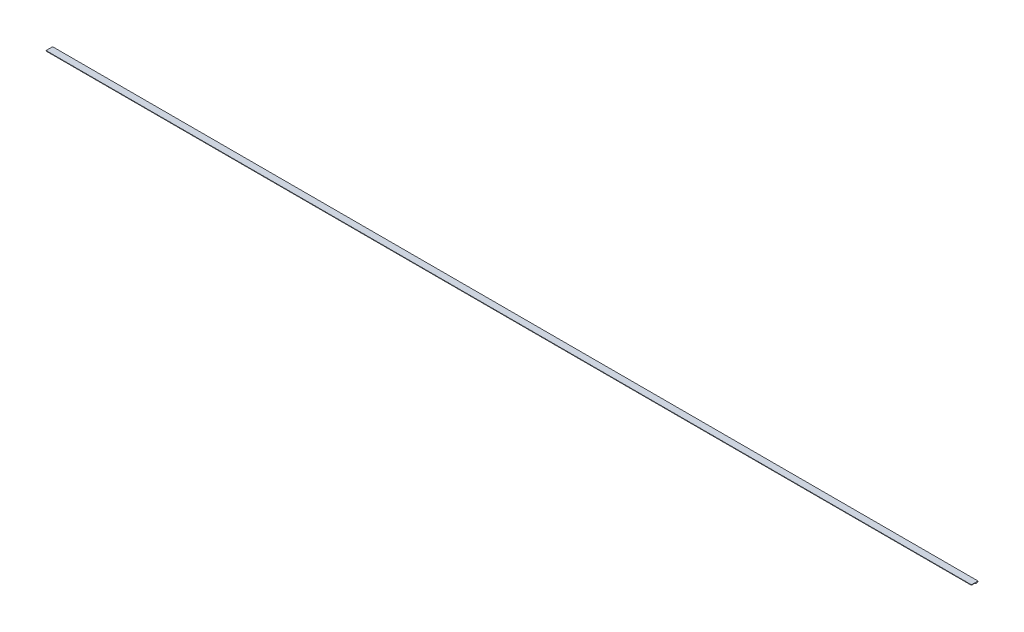
ISO-10303-21;
HEADER;
FILE_DESCRIPTION(('STEP AP214'),'2;1');
FILE_NAME('part.step','',(''),(''),'','','');
FILE_SCHEMA(('AUTOMOTIVE_DESIGN { 1 0 10303 214 1 1 1 1 }'));
ENDSEC;
DATA;
#1=APPLICATION_CONTEXT('core data for automotive mechanical design processes');
#2=APPLICATION_PROTOCOL_DEFINITION('international standard','automotive_design',2000,#1);
#3=PRODUCT_CONTEXT('',#1,'mechanical');
#4=PRODUCT('Part','Part','',(#3));
#5=PRODUCT_RELATED_PRODUCT_CATEGORY('part','',(#4));
#6=PRODUCT_DEFINITION_FORMATION('','',#4);
#7=PRODUCT_DEFINITION_CONTEXT('part definition',#1,'design');
#8=PRODUCT_DEFINITION('design','',#6,#7);
#9=PRODUCT_DEFINITION_SHAPE('','',#8);
#10=(LENGTH_UNIT() NAMED_UNIT(*) SI_UNIT(.MILLI.,.METRE.));
#11=(NAMED_UNIT(*) PLANE_ANGLE_UNIT() SI_UNIT($,.RADIAN.));
#12=(NAMED_UNIT(*) SI_UNIT($,.STERADIAN.) SOLID_ANGLE_UNIT());
#13=UNCERTAINTY_MEASURE_WITH_UNIT(LENGTH_MEASURE(1.E-05),#10,'distance_accuracy_value','');
#14=(GEOMETRIC_REPRESENTATION_CONTEXT(3) GLOBAL_UNCERTAINTY_ASSIGNED_CONTEXT((#13)) GLOBAL_UNIT_ASSIGNED_CONTEXT((#10,
#11,#12)) REPRESENTATION_CONTEXT('',''));
#15=CARTESIAN_POINT('',(0.,0.,0.));
#16=DIRECTION('',(0.,0.,1.));
#17=DIRECTION('',(1.,0.,0.));
#18=AXIS2_PLACEMENT_3D('',#15,#16,#17);
#19=CARTESIAN_POINT('',(1540.,-2.07695340816923,20.3369076558569));
#20=DIRECTION('',(1.,0.,0.));
#21=DIRECTION('',(0.,0.,-1.));
#22=AXIS2_PLACEMENT_3D('',#19,#20,#21);
#23=PLANE('',#22);
#24=DIRECTION('',(0.,-1.,0.));
#25=VECTOR('',#24,1.);
#26=CARTESIAN_POINT('',(1540.,0.,28.4739583333333));
#27=LINE('',#26,#25);
#28=CARTESIAN_POINT('',(1540.,0.,28.4739583333333));
#29=VERTEX_POINT('',#28);
#30=CARTESIAN_POINT('',(1540.,-0.759392904414108,28.4739583333333));
#31=VERTEX_POINT('',#30);
#32=EDGE_CURVE('E125',#29,#31,#27,.T.);
#33=ORIENTED_EDGE('',*,*,#32,.T.);
#34=DIRECTION('',(0.,0.,-1.));
#35=VECTOR('',#34,1.);
#36=CARTESIAN_POINT('',(1540.,-0.759392904414108,28.4739583333333));
#37=LINE('',#36,#35);
#38=CARTESIAN_POINT('',(1540.,-0.759392904414108,23.1998569783805));
#39=VERTEX_POINT('',#38);
#40=EDGE_CURVE('E84',#31,#39,#37,.T.);
#41=ORIENTED_EDGE('',*,*,#40,.T.);
#42=CARTESIAN_POINT('',(1540.,-0.759392904414108,23.1998569783805));
#43=CARTESIAN_POINT('',(1540.,-3.39451391192434,20.3369076558569));
#44=CARTESIAN_POINT('',(1540.,-0.759392904414107,17.4739583333333));
#45=B_SPLINE_CURVE_WITH_KNOTS('',2,(#42,#43,#44),.UNSPECIFIED.,.F.,.F.,(3,3),(0.,1.),.UNSPECIFIED.);
#46=CARTESIAN_POINT('',(1540.,-0.759392904414107,17.4739583333333));
#47=VERTEX_POINT('',#46);
#48=EDGE_CURVE('E88',#39,#47,#45,.T.);
#49=ORIENTED_EDGE('',*,*,#48,.T.);
#50=DIRECTION('',(0.,1.,0.));
#51=VECTOR('',#50,1.);
#52=CARTESIAN_POINT('',(1540.,-0.759392904414107,17.4739583333333));
#53=LINE('',#52,#51);
#54=CARTESIAN_POINT('',(1540.,0.,17.4739583333333));
#55=VERTEX_POINT('',#54);
#56=EDGE_CURVE('E92',#47,#55,#53,.T.);
#57=ORIENTED_EDGE('',*,*,#56,.T.);
#58=DIRECTION('',(0.,0.,1.));
#59=VECTOR('',#58,1.);
#60=CARTESIAN_POINT('',(1540.,0.,28.4739583333333));
#61=LINE('',#60,#59);
#62=EDGE_CURVE('E50',#55,#29,#61,.T.);
#63=ORIENTED_EDGE('',*,*,#62,.T.);
#64=EDGE_LOOP('',(#33,#41,#49,#57,#63));
#65=FACE_BOUND('',#64,.T.);
#66=CARTESIAN_POINT('',(1540.,-0.759392904414108,20.3369076558569));
#67=DIRECTION('',(1.,0.,0.));
#68=DIRECTION('',(0.,0.,-1.));
#69=AXIS2_PLACEMENT_3D('',#66,#67,#68);
#70=ELLIPSE('',#69,1.00518614839146,0.387209531001297);
#71=CARTESIAN_POINT('',(1540.,-0.759392904414108,19.3317215074655));
#72=VERTEX_POINT('',#71);
#73=EDGE_CURVE('E115',#72,#72,#70,.T.);
#74=ORIENTED_EDGE('',*,*,#73,.F.);
#75=EDGE_LOOP('',(#74));
#76=FACE_BOUND('',#75,.T.);
#77=ADVANCED_FACE('F33',(#65,#76),#23,.T.);
#78=CARTESIAN_POINT('',(0.,-2.07695340816923,20.3369076558569));
#79=DIRECTION('',(1.,0.,0.));
#80=DIRECTION('',(0.,0.,-1.));
#81=AXIS2_PLACEMENT_3D('',#78,#79,#80);
#82=PLANE('',#81);
#83=DIRECTION('',(0.,-1.,0.));
#84=VECTOR('',#83,1.);
#85=CARTESIAN_POINT('',(0.,0.,28.4739583333333));
#86=LINE('',#85,#84);
#87=CARTESIAN_POINT('',(0.,0.,28.4739583333333));
#88=VERTEX_POINT('',#87);
#89=CARTESIAN_POINT('',(0.,-0.759392904414108,28.4739583333333));
#90=VERTEX_POINT('',#89);
#91=EDGE_CURVE('E111',#88,#90,#86,.T.);
#92=ORIENTED_EDGE('',*,*,#91,.F.);
#93=DIRECTION('',(0.,0.,1.));
#94=VECTOR('',#93,1.);
#95=CARTESIAN_POINT('',(0.,0.,28.4739583333333));
#96=LINE('',#95,#94);
#97=CARTESIAN_POINT('',(0.,0.,17.4739583333333));
#98=VERTEX_POINT('',#97);
#99=EDGE_CURVE('E76',#98,#88,#96,.T.);
#100=ORIENTED_EDGE('',*,*,#99,.F.);
#101=DIRECTION('',(0.,1.,0.));
#102=VECTOR('',#101,1.);
#103=CARTESIAN_POINT('',(0.,-0.759392904414107,17.4739583333333));
#104=LINE('',#103,#102);
#105=CARTESIAN_POINT('',(0.,-0.759392904414107,17.4739583333333));
#106=VERTEX_POINT('',#105);
#107=EDGE_CURVE('E70',#106,#98,#104,.T.);
#108=ORIENTED_EDGE('',*,*,#107,.F.);
#109=CARTESIAN_POINT('',(0.,-0.759392904414108,23.1998569783805));
#110=CARTESIAN_POINT('',(0.,-3.39451391192434,20.3369076558569));
#111=CARTESIAN_POINT('',(0.,-0.759392904414107,17.4739583333333));
#112=B_SPLINE_CURVE_WITH_KNOTS('',2,(#109,#110,#111),.UNSPECIFIED.,.F.,.F.,(3,3),(0.,1.),.UNSPECIFIED.);
#113=CARTESIAN_POINT('',(0.,-0.759392904414108,23.1998569783805));
#114=VERTEX_POINT('',#113);
#115=EDGE_CURVE('E99',#114,#106,#112,.T.);
#116=ORIENTED_EDGE('',*,*,#115,.F.);
#117=DIRECTION('',(0.,0.,-1.));
#118=VECTOR('',#117,1.);
#119=CARTESIAN_POINT('',(0.,-0.759392904414108,28.4739583333333));
#120=LINE('',#119,#118);
#121=EDGE_CURVE('E114',#90,#114,#120,.T.);
#122=ORIENTED_EDGE('',*,*,#121,.F.);
#123=EDGE_LOOP('',(#92,#100,#108,#116,#122));
#124=FACE_BOUND('',#123,.T.);
#125=CARTESIAN_POINT('',(0.,-0.759392904414108,20.3369076558569));
#126=DIRECTION('',(1.,0.,0.));
#127=DIRECTION('',(0.,0.,-1.));
#128=AXIS2_PLACEMENT_3D('',#125,#126,#127);
#129=ELLIPSE('',#128,1.00518614839146,0.387209531001297);
#130=CARTESIAN_POINT('',(0.,-0.759392904414108,19.3317215074655));
#131=VERTEX_POINT('',#130);
#132=EDGE_CURVE('E155',#131,#131,#129,.T.);
#133=ORIENTED_EDGE('',*,*,#132,.T.);
#134=EDGE_LOOP('',(#133));
#135=FACE_BOUND('',#134,.T.);
#136=ADVANCED_FACE('F129',(#124,#135),#82,.F.);
#137=CARTESIAN_POINT('',(1540.,0.,28.4739583333333));
#138=DIRECTION('',(0.,0.,-1.));
#139=DIRECTION('',(-1.,0.,0.));
#140=AXIS2_PLACEMENT_3D('',#137,#138,#139);
#141=PLANE('',#140);
#142=ORIENTED_EDGE('',*,*,#91,.T.);
#143=DIRECTION('',(-1.,0.,0.));
#144=VECTOR('',#143,1.);
#145=CARTESIAN_POINT('',(1540.,-0.759392904414108,28.4739583333333));
#146=LINE('',#145,#144);
#147=EDGE_CURVE('E11',#31,#90,#146,.T.);
#148=ORIENTED_EDGE('',*,*,#147,.F.);
#149=ORIENTED_EDGE('',*,*,#32,.F.);
#150=DIRECTION('',(-1.,0.,0.));
#151=VECTOR('',#150,1.);
#152=CARTESIAN_POINT('',(1540.,0.,28.4739583333333));
#153=LINE('',#152,#151);
#154=EDGE_CURVE('E104',#29,#88,#153,.T.);
#155=ORIENTED_EDGE('',*,*,#154,.T.);
#156=EDGE_LOOP('',(#142,#148,#149,#155));
#157=FACE_BOUND('',#156,.T.);
#158=ADVANCED_FACE('F35',(#157),#141,.F.);
#159=CARTESIAN_POINT('',(1540.,-0.759392904414108,28.4739583333333));
#160=DIRECTION('',(0.,1.,0.));
#161=DIRECTION('',(0.,0.,1.));
#162=AXIS2_PLACEMENT_3D('',#159,#160,#161);
#163=PLANE('',#162);
#164=ORIENTED_EDGE('',*,*,#121,.T.);
#165=DIRECTION('',(-1.,0.,0.));
#166=VECTOR('',#165,1.);
#167=CARTESIAN_POINT('',(1540.,-0.759392904414108,23.1998569783805));
#168=LINE('',#167,#166);
#169=EDGE_CURVE('E42',#39,#114,#168,.T.);
#170=ORIENTED_EDGE('',*,*,#169,.F.);
#171=ORIENTED_EDGE('',*,*,#40,.F.);
#172=ORIENTED_EDGE('',*,*,#147,.T.);
#173=EDGE_LOOP('',(#164,#170,#171,#172));
#174=FACE_BOUND('',#173,.T.);
#175=ADVANCED_FACE('F164',(#174),#163,.F.);
#176=DIRECTION('',(-1.,0.,0.));
#177=VECTOR('',#176,1.);
#178=SURFACE_OF_LINEAR_EXTRUSION('',#45,#177);
#179=ORIENTED_EDGE('',*,*,#115,.T.);
#180=DIRECTION('',(-1.,0.,0.));
#181=VECTOR('',#180,1.);
#182=CARTESIAN_POINT('',(1540.,-0.759392904414107,17.4739583333333));
#183=LINE('',#182,#181);
#184=EDGE_CURVE('E96',#47,#106,#183,.T.);
#185=ORIENTED_EDGE('',*,*,#184,.F.);
#186=ORIENTED_EDGE('',*,*,#48,.F.);
#187=ORIENTED_EDGE('',*,*,#169,.T.);
#188=EDGE_LOOP('',(#179,#185,#186,#187));
#189=FACE_BOUND('',#188,.T.);
#190=ADVANCED_FACE('F97',(#189),#178,.F.);
#191=CARTESIAN_POINT('',(1540.,-0.759392904414107,17.4739583333333));
#192=DIRECTION('',(0.,0.,1.));
#193=DIRECTION('',(0.,-1.,0.));
#194=AXIS2_PLACEMENT_3D('',#191,#192,#193);
#195=PLANE('',#194);
#196=ORIENTED_EDGE('',*,*,#107,.T.);
#197=DIRECTION('',(-1.,0.,0.));
#198=VECTOR('',#197,1.);
#199=CARTESIAN_POINT('',(1540.,0.,17.4739583333333));
#200=LINE('',#199,#198);
#201=EDGE_CURVE('E100',#55,#98,#200,.T.);
#202=ORIENTED_EDGE('',*,*,#201,.F.);
#203=ORIENTED_EDGE('',*,*,#56,.F.);
#204=ORIENTED_EDGE('',*,*,#184,.T.);
#205=EDGE_LOOP('',(#196,#202,#203,#204));
#206=FACE_BOUND('',#205,.T.);
#207=ADVANCED_FACE('F102',(#206),#195,.F.);
#208=CARTESIAN_POINT('',(1540.,0.,28.4739583333333));
#209=DIRECTION('',(0.,-1.,0.));
#210=DIRECTION('',(0.,0.,-1.));
#211=AXIS2_PLACEMENT_3D('',#208,#209,#210);
#212=PLANE('',#211);
#213=ORIENTED_EDGE('',*,*,#99,.T.);
#214=ORIENTED_EDGE('',*,*,#154,.F.);
#215=ORIENTED_EDGE('',*,*,#62,.F.);
#216=ORIENTED_EDGE('',*,*,#201,.T.);
#217=EDGE_LOOP('',(#213,#214,#215,#216));
#218=FACE_BOUND('',#217,.T.);
#219=ADVANCED_FACE('F134',(#218),#212,.F.);
#220=DIRECTION('',(-1.,0.,0.));
#221=VECTOR('',#220,1.);
#222=SURFACE_OF_LINEAR_EXTRUSION('',#70,#221);
#223=ORIENTED_EDGE('',*,*,#73,.T.);
#224=EDGE_LOOP('',(#223));
#225=FACE_BOUND('',#224,.T.);
#226=ORIENTED_EDGE('',*,*,#132,.F.);
#227=EDGE_LOOP('',(#226));
#228=FACE_BOUND('',#227,.T.);
#229=ADVANCED_FACE('F136',(#225,#228),#222,.T.);
#230=CLOSED_SHELL('',(#77,#136,#158,#175,#190,#207,#219,#229));
#231=MANIFOLD_SOLID_BREP('B2',#230);
#232=ADVANCED_BREP_SHAPE_REPRESENTATION('',(#18,#231),#14);
#233=SHAPE_DEFINITION_REPRESENTATION(#9,#232);
ENDSEC;
END-ISO-10303-21;
